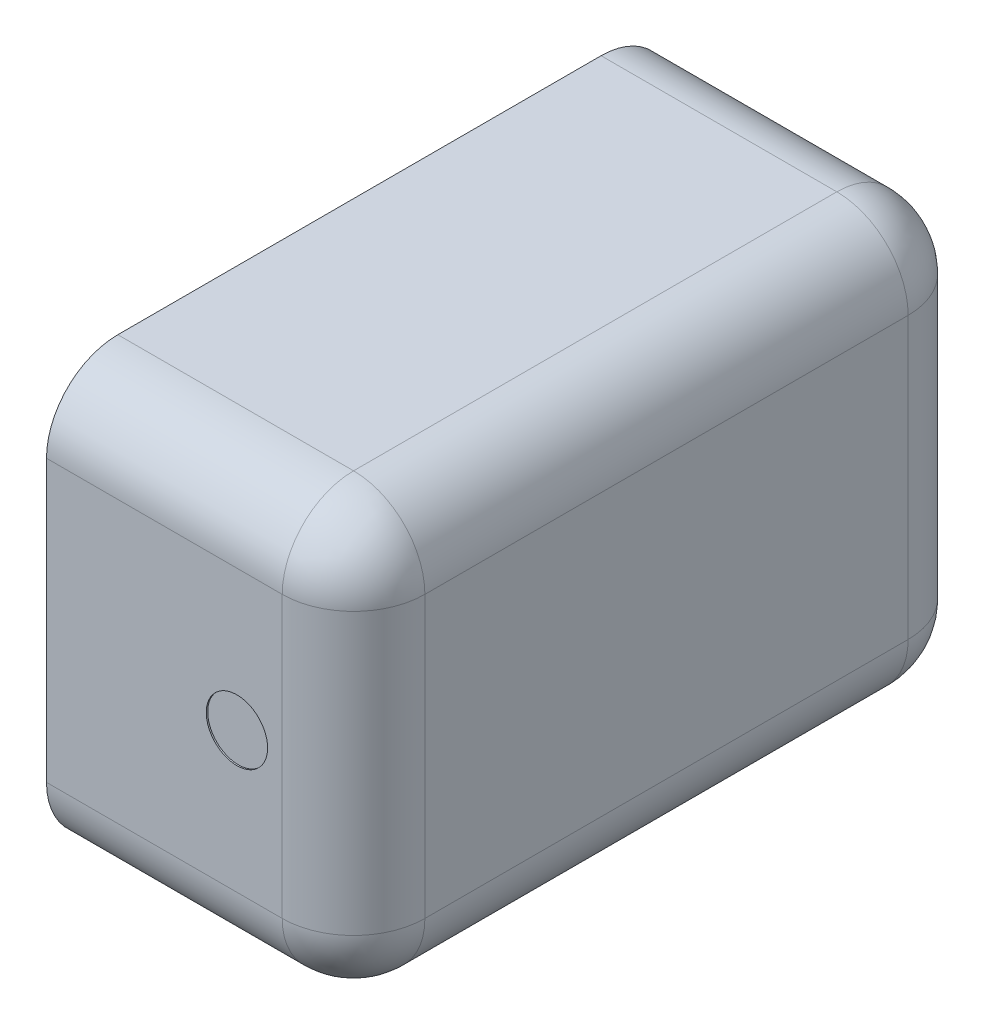
ISO-10303-21;
HEADER;
FILE_DESCRIPTION(('STEP AP214'),'2;1');
FILE_NAME('part.step','',(''),(''),'','','');
FILE_SCHEMA(('AUTOMOTIVE_DESIGN { 1 0 10303 214 1 1 1 1 }'));
ENDSEC;
DATA;
#1=APPLICATION_CONTEXT('core data for automotive mechanical design processes');
#2=APPLICATION_PROTOCOL_DEFINITION('international standard','automotive_design',2000,#1);
#3=PRODUCT_CONTEXT('',#1,'mechanical');
#4=PRODUCT('Part','Part','',(#3));
#5=PRODUCT_RELATED_PRODUCT_CATEGORY('part','',(#4));
#6=PRODUCT_DEFINITION_FORMATION('','',#4);
#7=PRODUCT_DEFINITION_CONTEXT('part definition',#1,'design');
#8=PRODUCT_DEFINITION('design','',#6,#7);
#9=PRODUCT_DEFINITION_SHAPE('','',#8);
#10=(LENGTH_UNIT() NAMED_UNIT(*) SI_UNIT(.MILLI.,.METRE.));
#11=(NAMED_UNIT(*) PLANE_ANGLE_UNIT() SI_UNIT($,.RADIAN.));
#12=(NAMED_UNIT(*) SI_UNIT($,.STERADIAN.) SOLID_ANGLE_UNIT());
#13=UNCERTAINTY_MEASURE_WITH_UNIT(LENGTH_MEASURE(1.E-05),#10,'distance_accuracy_value','');
#14=(GEOMETRIC_REPRESENTATION_CONTEXT(3) GLOBAL_UNCERTAINTY_ASSIGNED_CONTEXT((#13)) GLOBAL_UNIT_ASSIGNED_CONTEXT((#10,
#11,#12)) REPRESENTATION_CONTEXT('',''));
#15=CARTESIAN_POINT('',(0.,0.,0.));
#16=DIRECTION('',(0.,0.,1.));
#17=DIRECTION('',(1.,0.,0.));
#18=AXIS2_PLACEMENT_3D('',#15,#16,#17);
#19=CARTESIAN_POINT('',(43.05,29.675,-43.875));
#20=DIRECTION('',(0.,0.,1.));
#21=DIRECTION('',(0.,-1.,0.));
#22=AXIS2_PLACEMENT_3D('',#19,#20,#21);
#23=PLANE('',#22);
#24=DIRECTION('',(0.,1.,0.));
#25=VECTOR('',#24,1.);
#26=CARTESIAN_POINT('',(0.,29.675,-43.875));
#27=LINE('',#26,#25);
#28=CARTESIAN_POINT('',(0.,-19.675,-43.875));
#29=VERTEX_POINT('',#28);
#30=CARTESIAN_POINT('',(0.,19.675,-43.875));
#31=VERTEX_POINT('',#30);
#32=EDGE_CURVE('E144',#29,#31,#27,.T.);
#33=ORIENTED_EDGE('',*,*,#32,.T.);
#34=DIRECTION('',(-1.,0.,0.));
#35=VECTOR('',#34,1.);
#36=CARTESIAN_POINT('',(43.05,19.675,-43.875));
#37=LINE('',#36,#35);
#38=CARTESIAN_POINT('',(33.05,19.675,-43.875));
#39=VERTEX_POINT('',#38);
#40=EDGE_CURVE('E11',#31,#39,#37,.F.);
#41=ORIENTED_EDGE('',*,*,#40,.T.);
#42=DIRECTION('',(0.,1.,0.));
#43=VECTOR('',#42,1.);
#44=CARTESIAN_POINT('',(33.05,-29.675,-43.875));
#45=LINE('',#44,#43);
#46=CARTESIAN_POINT('',(33.05,-19.675,-43.875));
#47=VERTEX_POINT('',#46);
#48=EDGE_CURVE('E52',#39,#47,#45,.F.);
#49=ORIENTED_EDGE('',*,*,#48,.T.);
#50=DIRECTION('',(-1.,0.,0.));
#51=VECTOR('',#50,1.);
#52=CARTESIAN_POINT('',(43.05,-19.675,-43.875));
#53=LINE('',#52,#51);
#54=EDGE_CURVE('E45',#47,#29,#53,.T.);
#55=ORIENTED_EDGE('',*,*,#54,.T.);
#56=EDGE_LOOP('',(#33,#41,#49,#55));
#57=FACE_BOUND('',#56,.T.);
#58=ADVANCED_FACE('F36',(#57),#23,.F.);
#59=CARTESIAN_POINT('',(43.05,29.675,43.875));
#60=DIRECTION('',(0.,-1.,0.));
#61=DIRECTION('',(0.,0.,-1.));
#62=AXIS2_PLACEMENT_3D('',#59,#60,#61);
#63=PLANE('',#62);
#64=DIRECTION('',(0.,0.,1.));
#65=VECTOR('',#64,1.);
#66=CARTESIAN_POINT('',(0.,29.675,43.875));
#67=LINE('',#66,#65);
#68=CARTESIAN_POINT('',(0.,29.675,-33.875));
#69=VERTEX_POINT('',#68);
#70=CARTESIAN_POINT('',(0.,29.675,33.875));
#71=VERTEX_POINT('',#70);
#72=EDGE_CURVE('E139',#69,#71,#67,.T.);
#73=ORIENTED_EDGE('',*,*,#72,.T.);
#74=DIRECTION('',(-1.,0.,0.));
#75=VECTOR('',#74,1.);
#76=CARTESIAN_POINT('',(43.05,29.675,33.875));
#77=LINE('',#76,#75);
#78=CARTESIAN_POINT('',(33.05,29.675,33.875));
#79=VERTEX_POINT('',#78);
#80=EDGE_CURVE('E117',#71,#79,#77,.F.);
#81=ORIENTED_EDGE('',*,*,#80,.T.);
#82=DIRECTION('',(0.,0.,1.));
#83=VECTOR('',#82,1.);
#84=CARTESIAN_POINT('',(33.05,29.675,-43.875));
#85=LINE('',#84,#83);
#86=CARTESIAN_POINT('',(33.05,29.675,-33.875));
#87=VERTEX_POINT('',#86);
#88=EDGE_CURVE('E122',#79,#87,#85,.F.);
#89=ORIENTED_EDGE('',*,*,#88,.T.);
#90=DIRECTION('',(-1.,0.,0.));
#91=VECTOR('',#90,1.);
#92=CARTESIAN_POINT('',(43.05,29.675,-33.875));
#93=LINE('',#92,#91);
#94=EDGE_CURVE('E155',#87,#69,#93,.T.);
#95=ORIENTED_EDGE('',*,*,#94,.T.);
#96=EDGE_LOOP('',(#73,#81,#89,#95));
#97=FACE_BOUND('',#96,.T.);
#98=ADVANCED_FACE('F230',(#97),#63,.F.);
#99=CARTESIAN_POINT('',(43.05,29.675,43.875));
#100=DIRECTION('',(0.,0.,-1.));
#101=DIRECTION('',(0.,1.,0.));
#102=AXIS2_PLACEMENT_3D('',#99,#100,#101);
#103=PLANE('',#102);
#104=CARTESIAN_POINT('',(26.7,0.,43.875));
#105=DIRECTION('',(0.,0.,1.));
#106=DIRECTION('',(1.,0.,0.));
#107=AXIS2_PLACEMENT_3D('',#104,#105,#106);
#108=CIRCLE('',#107,4.3);
#109=CARTESIAN_POINT('',(31.,0.,43.875));
#110=VERTEX_POINT('',#109);
#111=EDGE_CURVE('E214',#110,#110,#108,.T.);
#112=ORIENTED_EDGE('',*,*,#111,.F.);
#113=EDGE_LOOP('',(#112));
#114=FACE_BOUND('',#113,.T.);
#115=DIRECTION('',(0.,-1.,0.));
#116=VECTOR('',#115,1.);
#117=CARTESIAN_POINT('',(33.05,29.675,43.875));
#118=LINE('',#117,#116);
#119=CARTESIAN_POINT('',(33.05,-19.675,43.875));
#120=VERTEX_POINT('',#119);
#121=CARTESIAN_POINT('',(33.05,19.675,43.875));
#122=VERTEX_POINT('',#121);
#123=EDGE_CURVE('E131',#120,#122,#118,.F.);
#124=ORIENTED_EDGE('',*,*,#123,.T.);
#125=DIRECTION('',(-1.,0.,0.));
#126=VECTOR('',#125,1.);
#127=CARTESIAN_POINT('',(43.05,19.675,43.875));
#128=LINE('',#127,#126);
#129=CARTESIAN_POINT('',(0.,19.675,43.875));
#130=VERTEX_POINT('',#129);
#131=EDGE_CURVE('E116',#122,#130,#128,.T.);
#132=ORIENTED_EDGE('',*,*,#131,.T.);
#133=DIRECTION('',(0.,-1.,0.));
#134=VECTOR('',#133,1.);
#135=CARTESIAN_POINT('',(0.,29.675,43.875));
#136=LINE('',#135,#134);
#137=CARTESIAN_POINT('',(0.,-19.675,43.875));
#138=VERTEX_POINT('',#137);
#139=EDGE_CURVE('E128',#130,#138,#136,.T.);
#140=ORIENTED_EDGE('',*,*,#139,.T.);
#141=DIRECTION('',(-1.,0.,0.));
#142=VECTOR('',#141,1.);
#143=CARTESIAN_POINT('',(43.05,-19.675,43.875));
#144=LINE('',#143,#142);
#145=EDGE_CURVE('E142',#138,#120,#144,.F.);
#146=ORIENTED_EDGE('',*,*,#145,.T.);
#147=EDGE_LOOP('',(#124,#132,#140,#146));
#148=FACE_BOUND('',#147,.T.);
#149=ADVANCED_FACE('F127',(#114,#148),#103,.F.);
#150=CARTESIAN_POINT('',(43.05,-29.675,43.875));
#151=DIRECTION('',(0.,1.,0.));
#152=DIRECTION('',(0.,0.,1.));
#153=AXIS2_PLACEMENT_3D('',#150,#151,#152);
#154=PLANE('',#153);
#155=DIRECTION('',(0.,0.,-1.));
#156=VECTOR('',#155,1.);
#157=CARTESIAN_POINT('',(33.05,-29.675,43.875));
#158=LINE('',#157,#156);
#159=CARTESIAN_POINT('',(33.05,-29.675,-33.875));
#160=VERTEX_POINT('',#159);
#161=CARTESIAN_POINT('',(33.05,-29.675,33.875));
#162=VERTEX_POINT('',#161);
#163=EDGE_CURVE('E167',#160,#162,#158,.F.);
#164=ORIENTED_EDGE('',*,*,#163,.T.);
#165=DIRECTION('',(-1.,0.,0.));
#166=VECTOR('',#165,1.);
#167=CARTESIAN_POINT('',(43.05,-29.675,33.875));
#168=LINE('',#167,#166);
#169=CARTESIAN_POINT('',(0.,-29.675,33.875));
#170=VERTEX_POINT('',#169);
#171=EDGE_CURVE('E171',#162,#170,#168,.T.);
#172=ORIENTED_EDGE('',*,*,#171,.T.);
#173=DIRECTION('',(0.,0.,-1.));
#174=VECTOR('',#173,1.);
#175=CARTESIAN_POINT('',(0.,-29.675,43.875));
#176=LINE('',#175,#174);
#177=CARTESIAN_POINT('',(0.,-29.675,-33.875));
#178=VERTEX_POINT('',#177);
#179=EDGE_CURVE('E138',#170,#178,#176,.T.);
#180=ORIENTED_EDGE('',*,*,#179,.T.);
#181=DIRECTION('',(-1.,0.,0.));
#182=VECTOR('',#181,1.);
#183=CARTESIAN_POINT('',(43.05,-29.675,-33.875));
#184=LINE('',#183,#182);
#185=EDGE_CURVE('E169',#178,#160,#184,.F.);
#186=ORIENTED_EDGE('',*,*,#185,.T.);
#187=EDGE_LOOP('',(#164,#172,#180,#186));
#188=FACE_BOUND('',#187,.T.);
#189=ADVANCED_FACE('F229',(#188),#154,.F.);
#190=CARTESIAN_POINT('',(43.05,0.,0.));
#191=DIRECTION('',(1.,0.,0.));
#192=DIRECTION('',(0.,0.,-1.));
#193=AXIS2_PLACEMENT_3D('',#190,#191,#192);
#194=PLANE('',#193);
#195=DIRECTION('',(0.,0.,1.));
#196=VECTOR('',#195,1.);
#197=CARTESIAN_POINT('',(43.05,19.675,43.875));
#198=LINE('',#197,#196);
#199=CARTESIAN_POINT('',(43.05,19.675,-33.875));
#200=VERTEX_POINT('',#199);
#201=CARTESIAN_POINT('',(43.05,19.675,33.875));
#202=VERTEX_POINT('',#201);
#203=EDGE_CURVE('E158',#200,#202,#198,.T.);
#204=ORIENTED_EDGE('',*,*,#203,.T.);
#205=DIRECTION('',(0.,-1.,0.));
#206=VECTOR('',#205,1.);
#207=CARTESIAN_POINT('',(43.05,-29.675,33.875));
#208=LINE('',#207,#206);
#209=CARTESIAN_POINT('',(43.05,-19.675,33.875));
#210=VERTEX_POINT('',#209);
#211=EDGE_CURVE('E164',#202,#210,#208,.T.);
#212=ORIENTED_EDGE('',*,*,#211,.T.);
#213=DIRECTION('',(0.,0.,-1.));
#214=VECTOR('',#213,1.);
#215=CARTESIAN_POINT('',(43.05,-19.675,-43.875));
#216=LINE('',#215,#214);
#217=CARTESIAN_POINT('',(43.05,-19.675,-33.875));
#218=VERTEX_POINT('',#217);
#219=EDGE_CURVE('E162',#210,#218,#216,.T.);
#220=ORIENTED_EDGE('',*,*,#219,.T.);
#221=DIRECTION('',(0.,1.,0.));
#222=VECTOR('',#221,1.);
#223=CARTESIAN_POINT('',(43.05,29.675,-33.875));
#224=LINE('',#223,#222);
#225=EDGE_CURVE('E160',#218,#200,#224,.T.);
#226=ORIENTED_EDGE('',*,*,#225,.T.);
#227=EDGE_LOOP('',(#204,#212,#220,#226));
#228=FACE_BOUND('',#227,.T.);
#229=ADVANCED_FACE('F236',(#228),#194,.T.);
#230=CARTESIAN_POINT('',(0.,0.,0.));
#231=DIRECTION('',(1.,0.,0.));
#232=DIRECTION('',(0.,0.,-1.));
#233=AXIS2_PLACEMENT_3D('',#230,#231,#232);
#234=PLANE('',#233);
#235=ORIENTED_EDGE('',*,*,#139,.F.);
#236=CARTESIAN_POINT('',(0.,19.675,33.875));
#237=DIRECTION('',(1.,0.,0.));
#238=DIRECTION('',(0.,0.,-1.));
#239=AXIS2_PLACEMENT_3D('',#236,#237,#238);
#240=CIRCLE('',#239,10.);
#241=EDGE_CURVE('E112',#130,#71,#240,.F.);
#242=ORIENTED_EDGE('',*,*,#241,.T.);
#243=ORIENTED_EDGE('',*,*,#72,.F.);
#244=CARTESIAN_POINT('',(0.,19.675,-33.875));
#245=DIRECTION('',(1.,0.,0.));
#246=DIRECTION('',(0.,0.,-1.));
#247=AXIS2_PLACEMENT_3D('',#244,#245,#246);
#248=CIRCLE('',#247,10.);
#249=EDGE_CURVE('E151',#69,#31,#248,.F.);
#250=ORIENTED_EDGE('',*,*,#249,.T.);
#251=ORIENTED_EDGE('',*,*,#32,.F.);
#252=CARTESIAN_POINT('',(0.,-19.675,-33.875));
#253=DIRECTION('',(1.,0.,0.));
#254=DIRECTION('',(0.,0.,-1.));
#255=AXIS2_PLACEMENT_3D('',#252,#253,#254);
#256=CIRCLE('',#255,10.);
#257=EDGE_CURVE('E133',#29,#178,#256,.F.);
#258=ORIENTED_EDGE('',*,*,#257,.T.);
#259=ORIENTED_EDGE('',*,*,#179,.F.);
#260=CARTESIAN_POINT('',(0.,-19.675,33.875));
#261=DIRECTION('',(1.,0.,0.));
#262=DIRECTION('',(0.,0.,-1.));
#263=AXIS2_PLACEMENT_3D('',#260,#261,#262);
#264=CIRCLE('',#263,10.);
#265=EDGE_CURVE('E123',#170,#138,#264,.F.);
#266=ORIENTED_EDGE('',*,*,#265,.T.);
#267=EDGE_LOOP('',(#235,#242,#243,#250,#251,#258,#259,#266));
#268=FACE_BOUND('',#267,.T.);
#269=ADVANCED_FACE('F135',(#268),#234,.F.);
#270=CARTESIAN_POINT('',(43.05,-19.675,-33.875));
#271=DIRECTION('',(-1.,0.,0.));
#272=DIRECTION('',(0.,0.,1.));
#273=AXIS2_PLACEMENT_3D('',#270,#271,#272);
#274=CYLINDRICAL_SURFACE('',#273,10.);
#275=CARTESIAN_POINT('',(33.05,-19.675,-33.875));
#276=DIRECTION('',(1.,0.,0.));
#277=DIRECTION('',(0.,0.,-1.));
#278=AXIS2_PLACEMENT_3D('',#275,#276,#277);
#279=CIRCLE('',#278,10.);
#280=EDGE_CURVE('E40',#160,#47,#279,.T.);
#281=ORIENTED_EDGE('',*,*,#280,.F.);
#282=ORIENTED_EDGE('',*,*,#185,.F.);
#283=ORIENTED_EDGE('',*,*,#257,.F.);
#284=ORIENTED_EDGE('',*,*,#54,.F.);
#285=EDGE_LOOP('',(#281,#282,#283,#284));
#286=FACE_BOUND('',#285,.T.);
#287=ADVANCED_FACE('F38',(#286),#274,.T.);
#288=CARTESIAN_POINT('',(33.05,-19.675,-33.875));
#289=DIRECTION('',(0.,0.,-1.));
#290=DIRECTION('',(0.,1.,0.));
#291=AXIS2_PLACEMENT_3D('',#288,#289,#290);
#292=SPHERICAL_SURFACE('',#291,10.);
#293=CARTESIAN_POINT('',(33.05,-19.675,-33.875));
#294=DIRECTION('',(0.,0.,-1.));
#295=DIRECTION('',(-1.,0.,0.));
#296=AXIS2_PLACEMENT_3D('',#293,#294,#295);
#297=CIRCLE('',#296,10.);
#298=EDGE_CURVE('E201',#160,#218,#297,.F.);
#299=ORIENTED_EDGE('',*,*,#298,.F.);
#300=ORIENTED_EDGE('',*,*,#280,.T.);
#301=CARTESIAN_POINT('',(33.05,-19.675,-33.875));
#302=DIRECTION('',(0.,-1.,0.));
#303=DIRECTION('',(0.,0.,-1.));
#304=AXIS2_PLACEMENT_3D('',#301,#302,#303);
#305=CIRCLE('',#304,10.);
#306=EDGE_CURVE('E203',#218,#47,#305,.F.);
#307=ORIENTED_EDGE('',*,*,#306,.F.);
#308=EDGE_LOOP('',(#299,#300,#307));
#309=FACE_BOUND('',#308,.T.);
#310=ADVANCED_FACE('F281',(#309),#292,.T.);
#311=CARTESIAN_POINT('',(43.05,19.675,-33.875));
#312=DIRECTION('',(-1.,0.,0.));
#313=DIRECTION('',(0.,0.,1.));
#314=AXIS2_PLACEMENT_3D('',#311,#312,#313);
#315=CYLINDRICAL_SURFACE('',#314,10.);
#316=ORIENTED_EDGE('',*,*,#249,.F.);
#317=ORIENTED_EDGE('',*,*,#94,.F.);
#318=CARTESIAN_POINT('',(33.05,19.675,-33.875));
#319=DIRECTION('',(1.,0.,0.));
#320=DIRECTION('',(0.,0.,-1.));
#321=AXIS2_PLACEMENT_3D('',#318,#319,#320);
#322=CIRCLE('',#321,10.);
#323=EDGE_CURVE('E198',#39,#87,#322,.T.);
#324=ORIENTED_EDGE('',*,*,#323,.F.);
#325=ORIENTED_EDGE('',*,*,#40,.F.);
#326=EDGE_LOOP('',(#316,#317,#324,#325));
#327=FACE_BOUND('',#326,.T.);
#328=ADVANCED_FACE('F279',(#327),#315,.T.);
#329=CARTESIAN_POINT('',(33.05,0.,-33.875));
#330=DIRECTION('',(0.,-1.,0.));
#331=DIRECTION('',(0.,0.,-1.));
#332=AXIS2_PLACEMENT_3D('',#329,#330,#331);
#333=CYLINDRICAL_SURFACE('',#332,10.);
#334=ORIENTED_EDGE('',*,*,#306,.T.);
#335=ORIENTED_EDGE('',*,*,#48,.F.);
#336=CARTESIAN_POINT('',(33.05,19.675,-33.875));
#337=DIRECTION('',(0.,1.,0.));
#338=DIRECTION('',(0.,0.,1.));
#339=AXIS2_PLACEMENT_3D('',#336,#337,#338);
#340=CIRCLE('',#339,10.);
#341=EDGE_CURVE('E195',#200,#39,#340,.T.);
#342=ORIENTED_EDGE('',*,*,#341,.F.);
#343=ORIENTED_EDGE('',*,*,#225,.F.);
#344=EDGE_LOOP('',(#334,#335,#342,#343));
#345=FACE_BOUND('',#344,.T.);
#346=ADVANCED_FACE('F275',(#345),#333,.T.);
#347=CARTESIAN_POINT('',(33.05,-19.675,0.));
#348=DIRECTION('',(0.,0.,1.));
#349=DIRECTION('',(1.,0.,0.));
#350=AXIS2_PLACEMENT_3D('',#347,#348,#349);
#351=CYLINDRICAL_SURFACE('',#350,10.);
#352=ORIENTED_EDGE('',*,*,#298,.T.);
#353=ORIENTED_EDGE('',*,*,#219,.F.);
#354=CARTESIAN_POINT('',(33.05,-19.675,33.875));
#355=DIRECTION('',(0.,0.,1.));
#356=DIRECTION('',(1.,0.,0.));
#357=AXIS2_PLACEMENT_3D('',#354,#355,#356);
#358=CIRCLE('',#357,10.);
#359=EDGE_CURVE('E192',#162,#210,#358,.T.);
#360=ORIENTED_EDGE('',*,*,#359,.F.);
#361=ORIENTED_EDGE('',*,*,#163,.F.);
#362=EDGE_LOOP('',(#352,#353,#360,#361));
#363=FACE_BOUND('',#362,.T.);
#364=ADVANCED_FACE('F271',(#363),#351,.T.);
#365=CARTESIAN_POINT('',(43.05,-19.675,33.875));
#366=DIRECTION('',(-1.,0.,0.));
#367=DIRECTION('',(0.,0.,1.));
#368=AXIS2_PLACEMENT_3D('',#365,#366,#367);
#369=CYLINDRICAL_SURFACE('',#368,10.);
#370=ORIENTED_EDGE('',*,*,#265,.F.);
#371=ORIENTED_EDGE('',*,*,#171,.F.);
#372=CARTESIAN_POINT('',(33.05,-19.675,33.875));
#373=DIRECTION('',(1.,0.,0.));
#374=DIRECTION('',(0.,0.,-1.));
#375=AXIS2_PLACEMENT_3D('',#372,#373,#374);
#376=CIRCLE('',#375,10.);
#377=EDGE_CURVE('E189',#120,#162,#376,.T.);
#378=ORIENTED_EDGE('',*,*,#377,.F.);
#379=ORIENTED_EDGE('',*,*,#145,.F.);
#380=EDGE_LOOP('',(#370,#371,#378,#379));
#381=FACE_BOUND('',#380,.T.);
#382=ADVANCED_FACE('F267',(#381),#369,.T.);
#383=CARTESIAN_POINT('',(33.05,19.675,-33.875));
#384=DIRECTION('',(0.,0.,-1.));
#385=DIRECTION('',(0.,1.,0.));
#386=AXIS2_PLACEMENT_3D('',#383,#384,#385);
#387=SPHERICAL_SURFACE('',#386,10.);
#388=ORIENTED_EDGE('',*,*,#341,.T.);
#389=ORIENTED_EDGE('',*,*,#323,.T.);
#390=CARTESIAN_POINT('',(33.05,19.675,-33.875));
#391=DIRECTION('',(0.,0.,-1.));
#392=DIRECTION('',(-1.,0.,0.));
#393=AXIS2_PLACEMENT_3D('',#390,#391,#392);
#394=CIRCLE('',#393,10.);
#395=EDGE_CURVE('E186',#200,#87,#394,.F.);
#396=ORIENTED_EDGE('',*,*,#395,.F.);
#397=EDGE_LOOP('',(#388,#389,#396));
#398=FACE_BOUND('',#397,.T.);
#399=ADVANCED_FACE('F263',(#398),#387,.T.);
#400=CARTESIAN_POINT('',(33.05,-19.675,33.875));
#401=DIRECTION('',(0.,-1.,0.));
#402=DIRECTION('',(0.,0.,-1.));
#403=AXIS2_PLACEMENT_3D('',#400,#401,#402);
#404=SPHERICAL_SURFACE('',#403,10.);
#405=ORIENTED_EDGE('',*,*,#377,.T.);
#406=ORIENTED_EDGE('',*,*,#359,.T.);
#407=CARTESIAN_POINT('',(33.05,-19.675,33.875));
#408=DIRECTION('',(0.,-1.,0.));
#409=DIRECTION('',(0.,0.,-1.));
#410=AXIS2_PLACEMENT_3D('',#407,#408,#409);
#411=CIRCLE('',#410,10.);
#412=EDGE_CURVE('E184',#120,#210,#411,.F.);
#413=ORIENTED_EDGE('',*,*,#412,.F.);
#414=EDGE_LOOP('',(#405,#406,#413));
#415=FACE_BOUND('',#414,.T.);
#416=ADVANCED_FACE('F259',(#415),#404,.T.);
#417=CARTESIAN_POINT('',(33.05,19.675,0.));
#418=DIRECTION('',(0.,0.,-1.));
#419=DIRECTION('',(-1.,0.,0.));
#420=AXIS2_PLACEMENT_3D('',#417,#418,#419);
#421=CYLINDRICAL_SURFACE('',#420,10.);
#422=ORIENTED_EDGE('',*,*,#395,.T.);
#423=ORIENTED_EDGE('',*,*,#88,.F.);
#424=CARTESIAN_POINT('',(33.05,19.675,33.875));
#425=DIRECTION('',(0.,0.,1.));
#426=DIRECTION('',(1.,0.,0.));
#427=AXIS2_PLACEMENT_3D('',#424,#425,#426);
#428=CIRCLE('',#427,10.);
#429=EDGE_CURVE('E181',#202,#79,#428,.T.);
#430=ORIENTED_EDGE('',*,*,#429,.F.);
#431=ORIENTED_EDGE('',*,*,#203,.F.);
#432=EDGE_LOOP('',(#422,#423,#430,#431));
#433=FACE_BOUND('',#432,.T.);
#434=ADVANCED_FACE('F255',(#433),#421,.T.);
#435=CARTESIAN_POINT('',(33.05,0.,33.875));
#436=DIRECTION('',(0.,1.,0.));
#437=DIRECTION('',(0.,0.,1.));
#438=AXIS2_PLACEMENT_3D('',#435,#436,#437);
#439=CYLINDRICAL_SURFACE('',#438,10.);
#440=ORIENTED_EDGE('',*,*,#412,.T.);
#441=ORIENTED_EDGE('',*,*,#211,.F.);
#442=CARTESIAN_POINT('',(33.05,19.675,33.875));
#443=DIRECTION('',(0.,1.,0.));
#444=DIRECTION('',(0.,0.,1.));
#445=AXIS2_PLACEMENT_3D('',#442,#443,#444);
#446=CIRCLE('',#445,10.);
#447=EDGE_CURVE('E177',#122,#202,#446,.T.);
#448=ORIENTED_EDGE('',*,*,#447,.F.);
#449=ORIENTED_EDGE('',*,*,#123,.F.);
#450=EDGE_LOOP('',(#440,#441,#448,#449));
#451=FACE_BOUND('',#450,.T.);
#452=ADVANCED_FACE('F251',(#451),#439,.T.);
#453=CARTESIAN_POINT('',(33.05,19.675,33.875));
#454=DIRECTION('',(1.,0.,0.));
#455=DIRECTION('',(0.,0.,-1.));
#456=AXIS2_PLACEMENT_3D('',#453,#454,#455);
#457=SPHERICAL_SURFACE('',#456,10.);
#458=ORIENTED_EDGE('',*,*,#447,.T.);
#459=ORIENTED_EDGE('',*,*,#429,.T.);
#460=CARTESIAN_POINT('',(33.05,19.675,33.875));
#461=DIRECTION('',(1.,0.,0.));
#462=DIRECTION('',(0.,0.,-1.));
#463=AXIS2_PLACEMENT_3D('',#460,#461,#462);
#464=CIRCLE('',#463,10.);
#465=EDGE_CURVE('E175',#122,#79,#464,.F.);
#466=ORIENTED_EDGE('',*,*,#465,.F.);
#467=EDGE_LOOP('',(#458,#459,#466));
#468=FACE_BOUND('',#467,.T.);
#469=ADVANCED_FACE('F248',(#468),#457,.T.);
#470=CARTESIAN_POINT('',(43.05,19.675,33.875));
#471=DIRECTION('',(-1.,0.,0.));
#472=DIRECTION('',(0.,0.,1.));
#473=AXIS2_PLACEMENT_3D('',#470,#471,#472);
#474=CYLINDRICAL_SURFACE('',#473,10.);
#475=ORIENTED_EDGE('',*,*,#465,.T.);
#476=ORIENTED_EDGE('',*,*,#80,.F.);
#477=ORIENTED_EDGE('',*,*,#241,.F.);
#478=ORIENTED_EDGE('',*,*,#131,.F.);
#479=EDGE_LOOP('',(#475,#476,#477,#478));
#480=FACE_BOUND('',#479,.T.);
#481=ADVANCED_FACE('F115',(#480),#474,.T.);
#482=CARTESIAN_POINT('',(26.7,0.,43.675));
#483=DIRECTION('',(0.,0.,1.));
#484=DIRECTION('',(1.,0.,0.));
#485=AXIS2_PLACEMENT_3D('',#482,#483,#484);
#486=CYLINDRICAL_SURFACE('',#485,4.3);
#487=CARTESIAN_POINT('',(26.7,0.,43.675));
#488=DIRECTION('',(0.,0.,1.));
#489=DIRECTION('',(1.,0.,0.));
#490=AXIS2_PLACEMENT_3D('',#487,#488,#489);
#491=CIRCLE('',#490,4.3);
#492=CARTESIAN_POINT('',(31.,0.,43.675));
#493=VERTEX_POINT('',#492);
#494=EDGE_CURVE('E178',#493,#493,#491,.T.);
#495=ORIENTED_EDGE('',*,*,#494,.F.);
#496=EDGE_LOOP('',(#495));
#497=FACE_BOUND('',#496,.T.);
#498=ORIENTED_EDGE('',*,*,#111,.T.);
#499=EDGE_LOOP('',(#498));
#500=FACE_BOUND('',#499,.T.);
#501=ADVANCED_FACE('F222',(#497,#500),#486,.F.);
#502=CARTESIAN_POINT('',(26.7,0.,43.675));
#503=DIRECTION('',(0.,0.,1.));
#504=DIRECTION('',(1.,0.,0.));
#505=AXIS2_PLACEMENT_3D('',#502,#503,#504);
#506=PLANE('',#505);
#507=ORIENTED_EDGE('',*,*,#494,.T.);
#508=EDGE_LOOP('',(#507));
#509=FACE_BOUND('',#508,.T.);
#510=ADVANCED_FACE('F220',(#509),#506,.T.);
#511=CLOSED_SHELL('',(#58,#98,#149,#189,#229,#269,#287,#310,#328,#346,#364,#382,#399,#416,#434,
#452,#469,#481,#501,#510));
#512=MANIFOLD_SOLID_BREP('B2',#511);
#513=ADVANCED_BREP_SHAPE_REPRESENTATION('',(#18,#512),#14);
#514=SHAPE_DEFINITION_REPRESENTATION(#9,#513);
ENDSEC;
END-ISO-10303-21;
